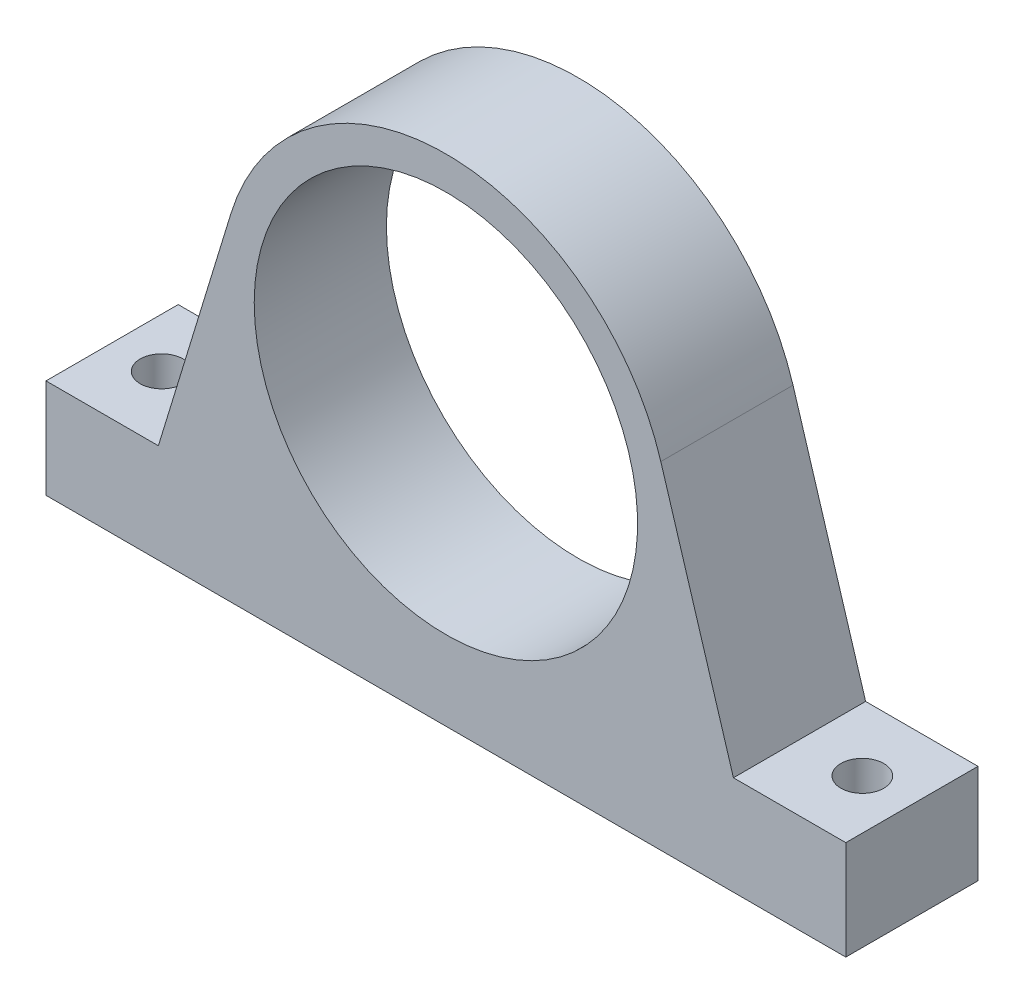
ISO-10303-21;
HEADER;
FILE_DESCRIPTION(('STEP AP214'),'2;1');
FILE_NAME('part.step','',(''),(''),'','','');
FILE_SCHEMA(('AUTOMOTIVE_DESIGN { 1 0 10303 214 1 1 1 1 }'));
ENDSEC;
DATA;
#1=APPLICATION_CONTEXT('core data for automotive mechanical design processes');
#2=APPLICATION_PROTOCOL_DEFINITION('international standard','automotive_design',2000,#1);
#3=PRODUCT_CONTEXT('',#1,'mechanical');
#4=PRODUCT('Part','Part','',(#3));
#5=PRODUCT_RELATED_PRODUCT_CATEGORY('part','',(#4));
#6=PRODUCT_DEFINITION_FORMATION('','',#4);
#7=PRODUCT_DEFINITION_CONTEXT('part definition',#1,'design');
#8=PRODUCT_DEFINITION('design','',#6,#7);
#9=PRODUCT_DEFINITION_SHAPE('','',#8);
#10=(LENGTH_UNIT() NAMED_UNIT(*) SI_UNIT(.MILLI.,.METRE.));
#11=(NAMED_UNIT(*) PLANE_ANGLE_UNIT() SI_UNIT($,.RADIAN.));
#12=(NAMED_UNIT(*) SI_UNIT($,.STERADIAN.) SOLID_ANGLE_UNIT());
#13=UNCERTAINTY_MEASURE_WITH_UNIT(LENGTH_MEASURE(1.E-05),#10,'distance_accuracy_value','');
#14=(GEOMETRIC_REPRESENTATION_CONTEXT(3) GLOBAL_UNCERTAINTY_ASSIGNED_CONTEXT((#13)) GLOBAL_UNIT_ASSIGNED_CONTEXT((#10,
#11,#12)) REPRESENTATION_CONTEXT('',''));
#15=CARTESIAN_POINT('',(0.,0.,0.));
#16=DIRECTION('',(0.,0.,1.));
#17=DIRECTION('',(1.,0.,0.));
#18=AXIS2_PLACEMENT_3D('',#15,#16,#17);
#19=CARTESIAN_POINT('',(-43.5,15.,20.));
#20=DIRECTION('',(-0.956323483326742,0.292310443258203,0.));
#21=DIRECTION('',(-0.292310443258203,-0.956323483326742,0.));
#22=AXIS2_PLACEMENT_3D('',#19,#20,#21);
#23=PLANE('',#22);
#24=DIRECTION('',(0.292310443258203,0.956323483326742,0.));
#25=VECTOR('',#24,1.);
#26=CARTESIAN_POINT('',(-43.5,15.,0.));
#27=LINE('',#26,#25);
#28=CARTESIAN_POINT('',(-43.5,15.,0.));
#29=VERTEX_POINT('',#28);
#30=CARTESIAN_POINT('',(-32.5149984331092,50.9385550707789,0.));
#31=VERTEX_POINT('',#30);
#32=EDGE_CURVE('E136',#29,#31,#27,.T.);
#33=ORIENTED_EDGE('',*,*,#32,.F.);
#34=DIRECTION('',(0.,0.,-1.));
#35=VECTOR('',#34,1.);
#36=CARTESIAN_POINT('',(-43.5,15.,20.));
#37=LINE('',#36,#35);
#38=CARTESIAN_POINT('',(-43.5,15.,20.));
#39=VERTEX_POINT('',#38);
#40=EDGE_CURVE('E11',#39,#29,#37,.T.);
#41=ORIENTED_EDGE('',*,*,#40,.F.);
#42=DIRECTION('',(0.292310443258203,0.956323483326742,0.));
#43=VECTOR('',#42,1.);
#44=CARTESIAN_POINT('',(-43.5,15.,20.));
#45=LINE('',#44,#43);
#46=CARTESIAN_POINT('',(-32.5149984331092,50.9385550707789,20.));
#47=VERTEX_POINT('',#46);
#48=EDGE_CURVE('E155',#39,#47,#45,.T.);
#49=ORIENTED_EDGE('',*,*,#48,.T.);
#50=DIRECTION('',(0.,0.,-1.));
#51=VECTOR('',#50,1.);
#52=CARTESIAN_POINT('',(-32.5149984331092,50.9385550707789,20.));
#53=LINE('',#52,#51);
#54=EDGE_CURVE('E97',#47,#31,#53,.T.);
#55=ORIENTED_EDGE('',*,*,#54,.T.);
#56=EDGE_LOOP('',(#33,#41,#49,#55));
#57=FACE_BOUND('',#56,.T.);
#58=ADVANCED_FACE('F41',(#57),#23,.T.);
#59=CARTESIAN_POINT('',(-60.5,15.,20.));
#60=DIRECTION('',(0.,1.,0.));
#61=DIRECTION('',(0.,0.,1.));
#62=AXIS2_PLACEMENT_3D('',#59,#60,#61);
#63=PLANE('',#62);
#64=CARTESIAN_POINT('',(-53.,15.,10.));
#65=DIRECTION('',(0.,1.,0.));
#66=DIRECTION('',(0.,0.,1.));
#67=AXIS2_PLACEMENT_3D('',#64,#65,#66);
#68=CIRCLE('',#67,3.25);
#69=CARTESIAN_POINT('',(-53.,15.,13.25));
#70=VERTEX_POINT('',#69);
#71=EDGE_CURVE('E172',#70,#70,#68,.T.);
#72=ORIENTED_EDGE('',*,*,#71,.F.);
#73=EDGE_LOOP('',(#72));
#74=FACE_BOUND('',#73,.T.);
#75=DIRECTION('',(1.,0.,0.));
#76=VECTOR('',#75,1.);
#77=CARTESIAN_POINT('',(-60.5,15.,0.));
#78=LINE('',#77,#76);
#79=CARTESIAN_POINT('',(-60.5,15.,0.));
#80=VERTEX_POINT('',#79);
#81=EDGE_CURVE('E153',#80,#29,#78,.T.);
#82=ORIENTED_EDGE('',*,*,#81,.F.);
#83=DIRECTION('',(0.,0.,-1.));
#84=VECTOR('',#83,1.);
#85=CARTESIAN_POINT('',(-60.5,15.,20.));
#86=LINE('',#85,#84);
#87=CARTESIAN_POINT('',(-60.5,15.,20.));
#88=VERTEX_POINT('',#87);
#89=EDGE_CURVE('E50',#88,#80,#86,.T.);
#90=ORIENTED_EDGE('',*,*,#89,.F.);
#91=DIRECTION('',(1.,0.,0.));
#92=VECTOR('',#91,1.);
#93=CARTESIAN_POINT('',(-60.5,15.,20.));
#94=LINE('',#93,#92);
#95=EDGE_CURVE('E131',#88,#39,#94,.T.);
#96=ORIENTED_EDGE('',*,*,#95,.T.);
#97=ORIENTED_EDGE('',*,*,#40,.T.);
#98=EDGE_LOOP('',(#82,#90,#96,#97));
#99=FACE_BOUND('',#98,.T.);
#100=ADVANCED_FACE('F204',(#74,#99),#63,.T.);
#101=CARTESIAN_POINT('',(-60.5,0.,20.));
#102=DIRECTION('',(-1.,0.,0.));
#103=DIRECTION('',(0.,0.,1.));
#104=AXIS2_PLACEMENT_3D('',#101,#102,#103);
#105=PLANE('',#104);
#106=DIRECTION('',(0.,1.,0.));
#107=VECTOR('',#106,1.);
#108=CARTESIAN_POINT('',(-60.5,0.,0.));
#109=LINE('',#108,#107);
#110=CARTESIAN_POINT('',(-60.5,0.,0.));
#111=VERTEX_POINT('',#110);
#112=EDGE_CURVE('E117',#111,#80,#109,.T.);
#113=ORIENTED_EDGE('',*,*,#112,.F.);
#114=DIRECTION('',(0.,0.,-1.));
#115=VECTOR('',#114,1.);
#116=CARTESIAN_POINT('',(-60.5,0.,20.));
#117=LINE('',#116,#115);
#118=CARTESIAN_POINT('',(-60.5,0.,20.));
#119=VERTEX_POINT('',#118);
#120=EDGE_CURVE('E111',#119,#111,#117,.T.);
#121=ORIENTED_EDGE('',*,*,#120,.F.);
#122=DIRECTION('',(0.,1.,0.));
#123=VECTOR('',#122,1.);
#124=CARTESIAN_POINT('',(-60.5,0.,20.));
#125=LINE('',#124,#123);
#126=EDGE_CURVE('E115',#119,#88,#125,.T.);
#127=ORIENTED_EDGE('',*,*,#126,.T.);
#128=ORIENTED_EDGE('',*,*,#89,.T.);
#129=EDGE_LOOP('',(#113,#121,#127,#128));
#130=FACE_BOUND('',#129,.T.);
#131=ADVANCED_FACE('F113',(#130),#105,.T.);
#132=CARTESIAN_POINT('',(-60.5,0.,20.));
#133=DIRECTION('',(0.,1.,0.));
#134=DIRECTION('',(-1.,0.,0.));
#135=AXIS2_PLACEMENT_3D('',#132,#133,#134);
#136=PLANE('',#135);
#137=CARTESIAN_POINT('',(53.,0.,10.));
#138=DIRECTION('',(0.,-1.,0.));
#139=DIRECTION('',(0.,0.,1.));
#140=AXIS2_PLACEMENT_3D('',#137,#138,#139);
#141=CIRCLE('',#140,3.25);
#142=CARTESIAN_POINT('',(53.,0.,13.25));
#143=VERTEX_POINT('',#142);
#144=EDGE_CURVE('E250',#143,#143,#141,.T.);
#145=ORIENTED_EDGE('',*,*,#144,.F.);
#146=EDGE_LOOP('',(#145));
#147=FACE_BOUND('',#146,.T.);
#148=CARTESIAN_POINT('',(-53.,0.,10.));
#149=DIRECTION('',(0.,1.,0.));
#150=DIRECTION('',(0.,0.,1.));
#151=AXIS2_PLACEMENT_3D('',#148,#149,#150);
#152=CIRCLE('',#151,3.25);
#153=CARTESIAN_POINT('',(-53.,0.,13.25));
#154=VERTEX_POINT('',#153);
#155=EDGE_CURVE('E177',#154,#154,#152,.T.);
#156=ORIENTED_EDGE('',*,*,#155,.T.);
#157=EDGE_LOOP('',(#156));
#158=FACE_BOUND('',#157,.T.);
#159=DIRECTION('',(1.,0.,0.));
#160=VECTOR('',#159,1.);
#161=CARTESIAN_POINT('',(-60.5,0.,0.));
#162=LINE('',#161,#160);
#163=CARTESIAN_POINT('',(60.5,0.,0.));
#164=VERTEX_POINT('',#163);
#165=EDGE_CURVE('E150',#111,#164,#162,.T.);
#166=ORIENTED_EDGE('',*,*,#165,.T.);
#167=DIRECTION('',(0.,0.,-1.));
#168=VECTOR('',#167,1.);
#169=CARTESIAN_POINT('',(60.5,0.,20.));
#170=LINE('',#169,#168);
#171=CARTESIAN_POINT('',(60.5,0.,20.));
#172=VERTEX_POINT('',#171);
#173=EDGE_CURVE('E120',#172,#164,#170,.T.);
#174=ORIENTED_EDGE('',*,*,#173,.F.);
#175=DIRECTION('',(1.,0.,0.));
#176=VECTOR('',#175,1.);
#177=CARTESIAN_POINT('',(-60.5,0.,20.));
#178=LINE('',#177,#176);
#179=EDGE_CURVE('E123',#119,#172,#178,.T.);
#180=ORIENTED_EDGE('',*,*,#179,.F.);
#181=ORIENTED_EDGE('',*,*,#120,.T.);
#182=EDGE_LOOP('',(#166,#174,#180,#181));
#183=FACE_BOUND('',#182,.T.);
#184=ADVANCED_FACE('F124',(#147,#158,#183),#136,.F.);
#185=CARTESIAN_POINT('',(60.5,0.,20.));
#186=DIRECTION('',(-1.,0.,0.));
#187=DIRECTION('',(0.,0.,1.));
#188=AXIS2_PLACEMENT_3D('',#185,#186,#187);
#189=PLANE('',#188);
#190=DIRECTION('',(0.,1.,0.));
#191=VECTOR('',#190,1.);
#192=CARTESIAN_POINT('',(60.5,0.,0.));
#193=LINE('',#192,#191);
#194=CARTESIAN_POINT('',(60.5,15.,0.));
#195=VERTEX_POINT('',#194);
#196=EDGE_CURVE('E148',#164,#195,#193,.T.);
#197=ORIENTED_EDGE('',*,*,#196,.T.);
#198=DIRECTION('',(0.,0.,-1.));
#199=VECTOR('',#198,1.);
#200=CARTESIAN_POINT('',(60.5,15.,20.));
#201=LINE('',#200,#199);
#202=CARTESIAN_POINT('',(60.5,15.,20.));
#203=VERTEX_POINT('',#202);
#204=EDGE_CURVE('E159',#203,#195,#201,.T.);
#205=ORIENTED_EDGE('',*,*,#204,.F.);
#206=DIRECTION('',(0.,1.,0.));
#207=VECTOR('',#206,1.);
#208=CARTESIAN_POINT('',(60.5,0.,20.));
#209=LINE('',#208,#207);
#210=EDGE_CURVE('E128',#172,#203,#209,.T.);
#211=ORIENTED_EDGE('',*,*,#210,.F.);
#212=ORIENTED_EDGE('',*,*,#173,.T.);
#213=EDGE_LOOP('',(#197,#205,#211,#212));
#214=FACE_BOUND('',#213,.T.);
#215=ADVANCED_FACE('F191',(#214),#189,.F.);
#216=CARTESIAN_POINT('',(60.5,15.,20.));
#217=DIRECTION('',(0.,-1.,0.));
#218=DIRECTION('',(1.,0.,0.));
#219=AXIS2_PLACEMENT_3D('',#216,#217,#218);
#220=PLANE('',#219);
#221=CARTESIAN_POINT('',(53.,15.,10.));
#222=DIRECTION('',(0.,-1.,0.));
#223=DIRECTION('',(1.,0.,0.));
#224=AXIS2_PLACEMENT_3D('',#221,#222,#223);
#225=CIRCLE('',#224,3.25);
#226=CARTESIAN_POINT('',(56.25,15.,10.));
#227=VERTEX_POINT('',#226);
#228=EDGE_CURVE('E44',#227,#227,#225,.F.);
#229=ORIENTED_EDGE('',*,*,#228,.F.);
#230=EDGE_LOOP('',(#229));
#231=FACE_BOUND('',#230,.T.);
#232=DIRECTION('',(-1.,0.,0.));
#233=VECTOR('',#232,1.);
#234=CARTESIAN_POINT('',(60.5,15.,0.));
#235=LINE('',#234,#233);
#236=CARTESIAN_POINT('',(43.5,15.,0.));
#237=VERTEX_POINT('',#236);
#238=EDGE_CURVE('E146',#195,#237,#235,.T.);
#239=ORIENTED_EDGE('',*,*,#238,.T.);
#240=DIRECTION('',(0.,0.,-1.));
#241=VECTOR('',#240,1.);
#242=CARTESIAN_POINT('',(43.5,15.,20.));
#243=LINE('',#242,#241);
#244=CARTESIAN_POINT('',(43.5,15.,20.));
#245=VERTEX_POINT('',#244);
#246=EDGE_CURVE('E162',#245,#237,#243,.T.);
#247=ORIENTED_EDGE('',*,*,#246,.F.);
#248=DIRECTION('',(-1.,0.,0.));
#249=VECTOR('',#248,1.);
#250=CARTESIAN_POINT('',(60.5,15.,20.));
#251=LINE('',#250,#249);
#252=EDGE_CURVE('E186',#203,#245,#251,.T.);
#253=ORIENTED_EDGE('',*,*,#252,.F.);
#254=ORIENTED_EDGE('',*,*,#204,.T.);
#255=EDGE_LOOP('',(#239,#247,#253,#254));
#256=FACE_BOUND('',#255,.T.);
#257=ADVANCED_FACE('F195',(#231,#256),#220,.F.);
#258=CARTESIAN_POINT('',(43.5,15.,20.));
#259=DIRECTION('',(-0.956323483326742,-0.292310443258202,0.));
#260=DIRECTION('',(0.292310443258202,-0.956323483326742,0.));
#261=AXIS2_PLACEMENT_3D('',#258,#259,#260);
#262=PLANE('',#261);
#263=DIRECTION('',(-0.292310443258202,0.956323483326742,0.));
#264=VECTOR('',#263,1.);
#265=CARTESIAN_POINT('',(43.5,15.,0.));
#266=LINE('',#265,#264);
#267=CARTESIAN_POINT('',(32.5149984331092,50.9385550707789,0.));
#268=VERTEX_POINT('',#267);
#269=EDGE_CURVE('E143',#237,#268,#266,.T.);
#270=ORIENTED_EDGE('',*,*,#269,.T.);
#271=DIRECTION('',(0.,0.,-1.));
#272=VECTOR('',#271,1.);
#273=CARTESIAN_POINT('',(32.5149984331092,50.9385550707789,20.));
#274=LINE('',#273,#272);
#275=CARTESIAN_POINT('',(32.5149984331092,50.9385550707789,20.));
#276=VERTEX_POINT('',#275);
#277=EDGE_CURVE('E165',#276,#268,#274,.T.);
#278=ORIENTED_EDGE('',*,*,#277,.F.);
#279=DIRECTION('',(-0.292310443258202,0.956323483326742,0.));
#280=VECTOR('',#279,1.);
#281=CARTESIAN_POINT('',(43.5,15.,20.));
#282=LINE('',#281,#280);
#283=EDGE_CURVE('E184',#245,#276,#282,.T.);
#284=ORIENTED_EDGE('',*,*,#283,.F.);
#285=ORIENTED_EDGE('',*,*,#246,.T.);
#286=EDGE_LOOP('',(#270,#278,#284,#285));
#287=FACE_BOUND('',#286,.T.);
#288=ADVANCED_FACE('F200',(#287),#262,.F.);
#289=CARTESIAN_POINT('',(0.,41.,20.));
#290=DIRECTION('',(0.,0.,-1.));
#291=DIRECTION('',(-1.,0.,0.));
#292=AXIS2_PLACEMENT_3D('',#289,#290,#291);
#293=CYLINDRICAL_SURFACE('',#292,34.);
#294=CARTESIAN_POINT('',(0.,41.,0.));
#295=DIRECTION('',(0.,0.,-1.));
#296=DIRECTION('',(-1.,0.,0.));
#297=AXIS2_PLACEMENT_3D('',#294,#295,#296);
#298=CIRCLE('',#297,34.);
#299=EDGE_CURVE('E139',#31,#268,#298,.T.);
#300=ORIENTED_EDGE('',*,*,#299,.F.);
#301=ORIENTED_EDGE('',*,*,#54,.F.);
#302=CARTESIAN_POINT('',(0.,41.,20.));
#303=DIRECTION('',(0.,0.,-1.));
#304=DIRECTION('',(-1.,0.,0.));
#305=AXIS2_PLACEMENT_3D('',#302,#303,#304);
#306=CIRCLE('',#305,34.);
#307=EDGE_CURVE('E182',#47,#276,#306,.T.);
#308=ORIENTED_EDGE('',*,*,#307,.T.);
#309=ORIENTED_EDGE('',*,*,#277,.T.);
#310=EDGE_LOOP('',(#300,#301,#308,#309));
#311=FACE_BOUND('',#310,.T.);
#312=ADVANCED_FACE('F201',(#311),#293,.T.);
#313=CARTESIAN_POINT('',(0.,41.,20.));
#314=DIRECTION('',(0.,0.,-1.));
#315=DIRECTION('',(-1.,0.,0.));
#316=AXIS2_PLACEMENT_3D('',#313,#314,#315);
#317=PLANE('',#316);
#318=CARTESIAN_POINT('',(0.,41.,20.));
#319=DIRECTION('',(0.,0.,-1.));
#320=DIRECTION('',(-1.,0.,0.));
#321=AXIS2_PLACEMENT_3D('',#318,#319,#320);
#322=CIRCLE('',#321,29.);
#323=CARTESIAN_POINT('',(-29.,41.,20.));
#324=VERTEX_POINT('',#323);
#325=EDGE_CURVE('E168',#324,#324,#322,.T.);
#326=ORIENTED_EDGE('',*,*,#325,.T.);
#327=EDGE_LOOP('',(#326));
#328=FACE_BOUND('',#327,.T.);
#329=ORIENTED_EDGE('',*,*,#48,.F.);
#330=ORIENTED_EDGE('',*,*,#95,.F.);
#331=ORIENTED_EDGE('',*,*,#126,.F.);
#332=ORIENTED_EDGE('',*,*,#179,.T.);
#333=ORIENTED_EDGE('',*,*,#210,.T.);
#334=ORIENTED_EDGE('',*,*,#252,.T.);
#335=ORIENTED_EDGE('',*,*,#283,.T.);
#336=ORIENTED_EDGE('',*,*,#307,.F.);
#337=EDGE_LOOP('',(#329,#330,#331,#332,#333,#334,#335,#336));
#338=FACE_BOUND('',#337,.T.);
#339=ADVANCED_FACE('F130',(#328,#338),#317,.F.);
#340=CARTESIAN_POINT('',(0.,41.,0.));
#341=DIRECTION('',(0.,0.,-1.));
#342=DIRECTION('',(-1.,0.,0.));
#343=AXIS2_PLACEMENT_3D('',#340,#341,#342);
#344=PLANE('',#343);
#345=CARTESIAN_POINT('',(0.,41.,0.));
#346=DIRECTION('',(0.,0.,-1.));
#347=DIRECTION('',(-1.,0.,0.));
#348=AXIS2_PLACEMENT_3D('',#345,#346,#347);
#349=CIRCLE('',#348,29.);
#350=CARTESIAN_POINT('',(-29.,41.,0.));
#351=VERTEX_POINT('',#350);
#352=EDGE_CURVE('E140',#351,#351,#349,.T.);
#353=ORIENTED_EDGE('',*,*,#352,.F.);
#354=EDGE_LOOP('',(#353));
#355=FACE_BOUND('',#354,.T.);
#356=ORIENTED_EDGE('',*,*,#32,.T.);
#357=ORIENTED_EDGE('',*,*,#299,.T.);
#358=ORIENTED_EDGE('',*,*,#269,.F.);
#359=ORIENTED_EDGE('',*,*,#238,.F.);
#360=ORIENTED_EDGE('',*,*,#196,.F.);
#361=ORIENTED_EDGE('',*,*,#165,.F.);
#362=ORIENTED_EDGE('',*,*,#112,.T.);
#363=ORIENTED_EDGE('',*,*,#81,.T.);
#364=EDGE_LOOP('',(#356,#357,#358,#359,#360,#361,#362,#363));
#365=FACE_BOUND('',#364,.T.);
#366=ADVANCED_FACE('F203',(#355,#365),#344,.T.);
#367=CARTESIAN_POINT('',(0.,41.,20.));
#368=DIRECTION('',(0.,0.,-1.));
#369=DIRECTION('',(-1.,0.,0.));
#370=AXIS2_PLACEMENT_3D('',#367,#368,#369);
#371=CYLINDRICAL_SURFACE('',#370,29.);
#372=ORIENTED_EDGE('',*,*,#352,.T.);
#373=EDGE_LOOP('',(#372));
#374=FACE_BOUND('',#373,.T.);
#375=ORIENTED_EDGE('',*,*,#325,.F.);
#376=EDGE_LOOP('',(#375));
#377=FACE_BOUND('',#376,.T.);
#378=ADVANCED_FACE('F235',(#374,#377),#371,.F.);
#379=CARTESIAN_POINT('',(-53.,0.,10.));
#380=DIRECTION('',(0.,1.,0.));
#381=DIRECTION('',(0.,0.,1.));
#382=AXIS2_PLACEMENT_3D('',#379,#380,#381);
#383=CYLINDRICAL_SURFACE('',#382,3.25);
#384=ORIENTED_EDGE('',*,*,#71,.T.);
#385=EDGE_LOOP('',(#384));
#386=FACE_BOUND('',#385,.T.);
#387=ORIENTED_EDGE('',*,*,#155,.F.);
#388=EDGE_LOOP('',(#387));
#389=FACE_BOUND('',#388,.T.);
#390=ADVANCED_FACE('F239',(#386,#389),#383,.F.);
#391=CARTESIAN_POINT('',(53.,0.,10.));
#392=DIRECTION('',(0.,1.,0.));
#393=DIRECTION('',(0.,0.,1.));
#394=AXIS2_PLACEMENT_3D('',#391,#392,#393);
#395=CYLINDRICAL_SURFACE('',#394,3.25);
#396=ORIENTED_EDGE('',*,*,#144,.T.);
#397=EDGE_LOOP('',(#396));
#398=FACE_BOUND('',#397,.T.);
#399=ORIENTED_EDGE('',*,*,#228,.T.);
#400=EDGE_LOOP('',(#399));
#401=FACE_BOUND('',#400,.T.);
#402=ADVANCED_FACE('F241',(#398,#401),#395,.F.);
#403=CLOSED_SHELL('',(#58,#100,#131,#184,#215,#257,#288,#312,#339,#366,#378,#390,#402));
#404=MANIFOLD_SOLID_BREP('B2',#403);
#405=ADVANCED_BREP_SHAPE_REPRESENTATION('',(#18,#404),#14);
#406=SHAPE_DEFINITION_REPRESENTATION(#9,#405);
ENDSEC;
END-ISO-10303-21;
